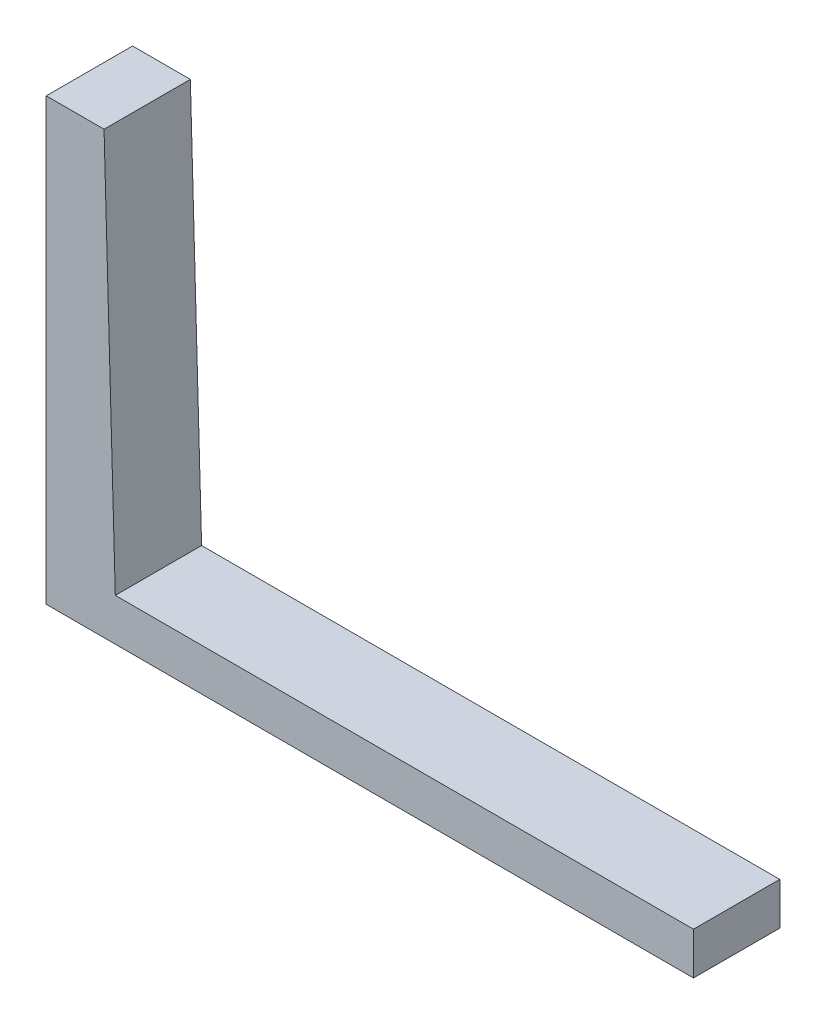
ISO-10303-21;
HEADER;
FILE_DESCRIPTION(('STEP AP214'),'2;1');
FILE_NAME('part.step','',(''),(''),'','','');
FILE_SCHEMA(('AUTOMOTIVE_DESIGN { 1 0 10303 214 1 1 1 1 }'));
ENDSEC;
DATA;
#1=APPLICATION_CONTEXT('core data for automotive mechanical design processes');
#2=APPLICATION_PROTOCOL_DEFINITION('international standard','automotive_design',2000,#1);
#3=PRODUCT_CONTEXT('',#1,'mechanical');
#4=PRODUCT('Part','Part','',(#3));
#5=PRODUCT_RELATED_PRODUCT_CATEGORY('part','',(#4));
#6=PRODUCT_DEFINITION_FORMATION('','',#4);
#7=PRODUCT_DEFINITION_CONTEXT('part definition',#1,'design');
#8=PRODUCT_DEFINITION('design','',#6,#7);
#9=PRODUCT_DEFINITION_SHAPE('','',#8);
#10=(LENGTH_UNIT() NAMED_UNIT(*) SI_UNIT(.MILLI.,.METRE.));
#11=(NAMED_UNIT(*) PLANE_ANGLE_UNIT() SI_UNIT($,.RADIAN.));
#12=(NAMED_UNIT(*) SI_UNIT($,.STERADIAN.) SOLID_ANGLE_UNIT());
#13=UNCERTAINTY_MEASURE_WITH_UNIT(LENGTH_MEASURE(1.E-05),#10,'distance_accuracy_value','');
#14=(GEOMETRIC_REPRESENTATION_CONTEXT(3) GLOBAL_UNCERTAINTY_ASSIGNED_CONTEXT((#13)) GLOBAL_UNIT_ASSIGNED_CONTEXT((#10,
#11,#12)) REPRESENTATION_CONTEXT('',''));
#15=CARTESIAN_POINT('',(0.,0.,0.));
#16=DIRECTION('',(0.,0.,1.));
#17=DIRECTION('',(1.,0.,0.));
#18=AXIS2_PLACEMENT_3D('',#15,#16,#17);
#19=CARTESIAN_POINT('',(37.5,4.89882592725905,5.));
#20=DIRECTION('',(-1.,0.,0.));
#21=DIRECTION('',(0.,0.,1.));
#22=AXIS2_PLACEMENT_3D('',#19,#20,#21);
#23=PLANE('',#22);
#24=DIRECTION('',(0.,1.,0.));
#25=VECTOR('',#24,1.);
#26=CARTESIAN_POINT('',(37.5,4.89882592725905,-5.));
#27=LINE('',#26,#25);
#28=CARTESIAN_POINT('',(37.5,0.,-5.));
#29=VERTEX_POINT('',#28);
#30=CARTESIAN_POINT('',(37.5,4.89882592725905,-5.));
#31=VERTEX_POINT('',#30);
#32=EDGE_CURVE('E125',#29,#31,#27,.T.);
#33=ORIENTED_EDGE('',*,*,#32,.T.);
#34=DIRECTION('',(0.,0.,-1.));
#35=VECTOR('',#34,1.);
#36=CARTESIAN_POINT('',(37.5,4.89882592725905,5.));
#37=LINE('',#36,#35);
#38=CARTESIAN_POINT('',(37.5,4.89882592725905,5.));
#39=VERTEX_POINT('',#38);
#40=EDGE_CURVE('E11',#39,#31,#37,.T.);
#41=ORIENTED_EDGE('',*,*,#40,.F.);
#42=DIRECTION('',(0.,1.,0.));
#43=VECTOR('',#42,1.);
#44=CARTESIAN_POINT('',(37.5,4.89882592725905,5.));
#45=LINE('',#44,#43);
#46=CARTESIAN_POINT('',(37.5,0.,5.));
#47=VERTEX_POINT('',#46);
#48=EDGE_CURVE('E135',#47,#39,#45,.T.);
#49=ORIENTED_EDGE('',*,*,#48,.F.);
#50=DIRECTION('',(0.,0.,-1.));
#51=VECTOR('',#50,1.);
#52=CARTESIAN_POINT('',(37.5,0.,5.));
#53=LINE('',#52,#51);
#54=EDGE_CURVE('E121',#47,#29,#53,.T.);
#55=ORIENTED_EDGE('',*,*,#54,.T.);
#56=EDGE_LOOP('',(#33,#41,#49,#55));
#57=FACE_BOUND('',#56,.T.);
#58=ADVANCED_FACE('F41',(#57),#23,.F.);
#59=CARTESIAN_POINT('',(-29.4982259531183,4.89882592725905,5.));
#60=DIRECTION('',(0.,-1.,0.));
#61=DIRECTION('',(0.,0.,-1.));
#62=AXIS2_PLACEMENT_3D('',#59,#60,#61);
#63=PLANE('',#62);
#64=DIRECTION('',(-1.,0.,0.));
#65=VECTOR('',#64,1.);
#66=CARTESIAN_POINT('',(-29.4982259531183,4.89882592725905,-5.));
#67=LINE('',#66,#65);
#68=CARTESIAN_POINT('',(-29.4982259531183,4.89882592725905,-5.));
#69=VERTEX_POINT('',#68);
#70=EDGE_CURVE('E128',#31,#69,#67,.T.);
#71=ORIENTED_EDGE('',*,*,#70,.T.);
#72=DIRECTION('',(0.,0.,-1.));
#73=VECTOR('',#72,1.);
#74=CARTESIAN_POINT('',(-29.4982259531183,4.89882592725905,5.));
#75=LINE('',#74,#73);
#76=CARTESIAN_POINT('',(-29.4982259531183,4.89882592725905,5.));
#77=VERTEX_POINT('',#76);
#78=EDGE_CURVE('E49',#77,#69,#75,.T.);
#79=ORIENTED_EDGE('',*,*,#78,.F.);
#80=DIRECTION('',(-1.,0.,0.));
#81=VECTOR('',#80,1.);
#82=CARTESIAN_POINT('',(-29.4982259531183,4.89882592725905,5.));
#83=LINE('',#82,#81);
#84=EDGE_CURVE('E94',#39,#77,#83,.T.);
#85=ORIENTED_EDGE('',*,*,#84,.F.);
#86=ORIENTED_EDGE('',*,*,#40,.T.);
#87=EDGE_LOOP('',(#71,#79,#85,#86));
#88=FACE_BOUND('',#87,.T.);
#89=ADVANCED_FACE('F159',(#88),#63,.F.);
#90=CARTESIAN_POINT('',(-30.8013948614773,51.0310052831707,5.));
#91=DIRECTION('',(-0.999601247282596,-0.0282373233695649,0.));
#92=DIRECTION('',(0.0282373233695649,-0.999601247282596,0.));
#93=AXIS2_PLACEMENT_3D('',#90,#91,#92);
#94=PLANE('',#93);
#95=DIRECTION('',(-0.0282373233695649,0.999601247282596,0.));
#96=VECTOR('',#95,1.);
#97=CARTESIAN_POINT('',(-30.8013948614773,51.0310052831707,-5.));
#98=LINE('',#97,#96);
#99=CARTESIAN_POINT('',(-30.8013948614773,51.0310052831707,-5.));
#100=VERTEX_POINT('',#99);
#101=EDGE_CURVE('E130',#69,#100,#98,.T.);
#102=ORIENTED_EDGE('',*,*,#101,.T.);
#103=DIRECTION('',(0.,0.,-1.));
#104=VECTOR('',#103,1.);
#105=CARTESIAN_POINT('',(-30.8013948614773,51.0310052831707,5.));
#106=LINE('',#105,#104);
#107=CARTESIAN_POINT('',(-30.8013948614773,51.0310052831707,5.));
#108=VERTEX_POINT('',#107);
#109=EDGE_CURVE('E116',#108,#100,#106,.T.);
#110=ORIENTED_EDGE('',*,*,#109,.F.);
#111=DIRECTION('',(-0.0282373233695649,0.999601247282596,0.));
#112=VECTOR('',#111,1.);
#113=CARTESIAN_POINT('',(-30.8013948614773,51.0310052831707,5.));
#114=LINE('',#113,#112);
#115=EDGE_CURVE('E107',#77,#108,#114,.T.);
#116=ORIENTED_EDGE('',*,*,#115,.F.);
#117=ORIENTED_EDGE('',*,*,#78,.T.);
#118=EDGE_LOOP('',(#102,#110,#116,#117));
#119=FACE_BOUND('',#118,.T.);
#120=ADVANCED_FACE('F141',(#119),#94,.F.);
#121=CARTESIAN_POINT('',(-37.5,51.0310052831707,5.));
#122=DIRECTION('',(0.,-1.,0.));
#123=DIRECTION('',(0.,0.,-1.));
#124=AXIS2_PLACEMENT_3D('',#121,#122,#123);
#125=PLANE('',#124);
#126=DIRECTION('',(-1.,0.,0.));
#127=VECTOR('',#126,1.);
#128=CARTESIAN_POINT('',(-37.5,51.0310052831707,-5.));
#129=LINE('',#128,#127);
#130=CARTESIAN_POINT('',(-37.5,51.0310052831707,-5.));
#131=VERTEX_POINT('',#130);
#132=EDGE_CURVE('E115',#100,#131,#129,.T.);
#133=ORIENTED_EDGE('',*,*,#132,.T.);
#134=DIRECTION('',(0.,0.,-1.));
#135=VECTOR('',#134,1.);
#136=CARTESIAN_POINT('',(-37.5,51.0310052831707,5.));
#137=LINE('',#136,#135);
#138=CARTESIAN_POINT('',(-37.5,51.0310052831707,5.));
#139=VERTEX_POINT('',#138);
#140=EDGE_CURVE('E112',#139,#131,#137,.T.);
#141=ORIENTED_EDGE('',*,*,#140,.F.);
#142=DIRECTION('',(-1.,0.,0.));
#143=VECTOR('',#142,1.);
#144=CARTESIAN_POINT('',(-37.5,51.0310052831707,5.));
#145=LINE('',#144,#143);
#146=EDGE_CURVE('E101',#108,#139,#145,.T.);
#147=ORIENTED_EDGE('',*,*,#146,.F.);
#148=ORIENTED_EDGE('',*,*,#109,.T.);
#149=EDGE_LOOP('',(#133,#141,#147,#148));
#150=FACE_BOUND('',#149,.T.);
#151=ADVANCED_FACE('F113',(#150),#125,.F.);
#152=CARTESIAN_POINT('',(-37.5,0.,5.));
#153=DIRECTION('',(1.,0.,0.));
#154=DIRECTION('',(0.,0.,-1.));
#155=AXIS2_PLACEMENT_3D('',#152,#153,#154);
#156=PLANE('',#155);
#157=DIRECTION('',(0.,-1.,0.));
#158=VECTOR('',#157,1.);
#159=CARTESIAN_POINT('',(-37.5,0.,-5.));
#160=LINE('',#159,#158);
#161=CARTESIAN_POINT('',(-37.5,0.,-5.));
#162=VERTEX_POINT('',#161);
#163=EDGE_CURVE('E80',#131,#162,#160,.T.);
#164=ORIENTED_EDGE('',*,*,#163,.T.);
#165=DIRECTION('',(0.,0.,-1.));
#166=VECTOR('',#165,1.);
#167=CARTESIAN_POINT('',(-37.5,0.,5.));
#168=LINE('',#167,#166);
#169=CARTESIAN_POINT('',(-37.5,0.,5.));
#170=VERTEX_POINT('',#169);
#171=EDGE_CURVE('E117',#170,#162,#168,.T.);
#172=ORIENTED_EDGE('',*,*,#171,.F.);
#173=DIRECTION('',(0.,-1.,0.));
#174=VECTOR('',#173,1.);
#175=CARTESIAN_POINT('',(-37.5,0.,5.));
#176=LINE('',#175,#174);
#177=EDGE_CURVE('E105',#139,#170,#176,.T.);
#178=ORIENTED_EDGE('',*,*,#177,.F.);
#179=ORIENTED_EDGE('',*,*,#140,.T.);
#180=EDGE_LOOP('',(#164,#172,#178,#179));
#181=FACE_BOUND('',#180,.T.);
#182=ADVANCED_FACE('F119',(#181),#156,.F.);
#183=CARTESIAN_POINT('',(-37.5,0.,5.));
#184=DIRECTION('',(0.,1.,0.));
#185=DIRECTION('',(0.,0.,1.));
#186=AXIS2_PLACEMENT_3D('',#183,#184,#185);
#187=PLANE('',#186);
#188=DIRECTION('',(1.,0.,0.));
#189=VECTOR('',#188,1.);
#190=CARTESIAN_POINT('',(-37.5,0.,-5.));
#191=LINE('',#190,#189);
#192=EDGE_CURVE('E86',#162,#29,#191,.T.);
#193=ORIENTED_EDGE('',*,*,#192,.T.);
#194=ORIENTED_EDGE('',*,*,#54,.F.);
#195=DIRECTION('',(1.,0.,0.));
#196=VECTOR('',#195,1.);
#197=CARTESIAN_POINT('',(-37.5,0.,5.));
#198=LINE('',#197,#196);
#199=EDGE_CURVE('E57',#170,#47,#198,.T.);
#200=ORIENTED_EDGE('',*,*,#199,.F.);
#201=ORIENTED_EDGE('',*,*,#171,.T.);
#202=EDGE_LOOP('',(#193,#194,#200,#201));
#203=FACE_BOUND('',#202,.T.);
#204=ADVANCED_FACE('F148',(#203),#187,.F.);
#205=CARTESIAN_POINT('',(0.,0.,5.));
#206=DIRECTION('',(0.,0.,1.));
#207=DIRECTION('',(1.,0.,0.));
#208=AXIS2_PLACEMENT_3D('',#205,#206,#207);
#209=PLANE('',#208);
#210=ORIENTED_EDGE('',*,*,#48,.T.);
#211=ORIENTED_EDGE('',*,*,#84,.T.);
#212=ORIENTED_EDGE('',*,*,#115,.T.);
#213=ORIENTED_EDGE('',*,*,#146,.T.);
#214=ORIENTED_EDGE('',*,*,#177,.T.);
#215=ORIENTED_EDGE('',*,*,#199,.T.);
#216=EDGE_LOOP('',(#210,#211,#212,#213,#214,#215));
#217=FACE_BOUND('',#216,.T.);
#218=ADVANCED_FACE('F103',(#217),#209,.T.);
#219=CARTESIAN_POINT('',(0.,0.,-5.));
#220=DIRECTION('',(0.,0.,1.));
#221=DIRECTION('',(1.,0.,0.));
#222=AXIS2_PLACEMENT_3D('',#219,#220,#221);
#223=PLANE('',#222);
#224=ORIENTED_EDGE('',*,*,#32,.F.);
#225=ORIENTED_EDGE('',*,*,#192,.F.);
#226=ORIENTED_EDGE('',*,*,#163,.F.);
#227=ORIENTED_EDGE('',*,*,#132,.F.);
#228=ORIENTED_EDGE('',*,*,#101,.F.);
#229=ORIENTED_EDGE('',*,*,#70,.F.);
#230=EDGE_LOOP('',(#224,#225,#226,#227,#228,#229));
#231=FACE_BOUND('',#230,.T.);
#232=ADVANCED_FACE('F144',(#231),#223,.F.);
#233=CLOSED_SHELL('',(#58,#89,#120,#151,#182,#204,#218,#232));
#234=MANIFOLD_SOLID_BREP('B2',#233);
#235=ADVANCED_BREP_SHAPE_REPRESENTATION('',(#18,#234),#14);
#236=SHAPE_DEFINITION_REPRESENTATION(#9,#235);
ENDSEC;
END-ISO-10303-21;
